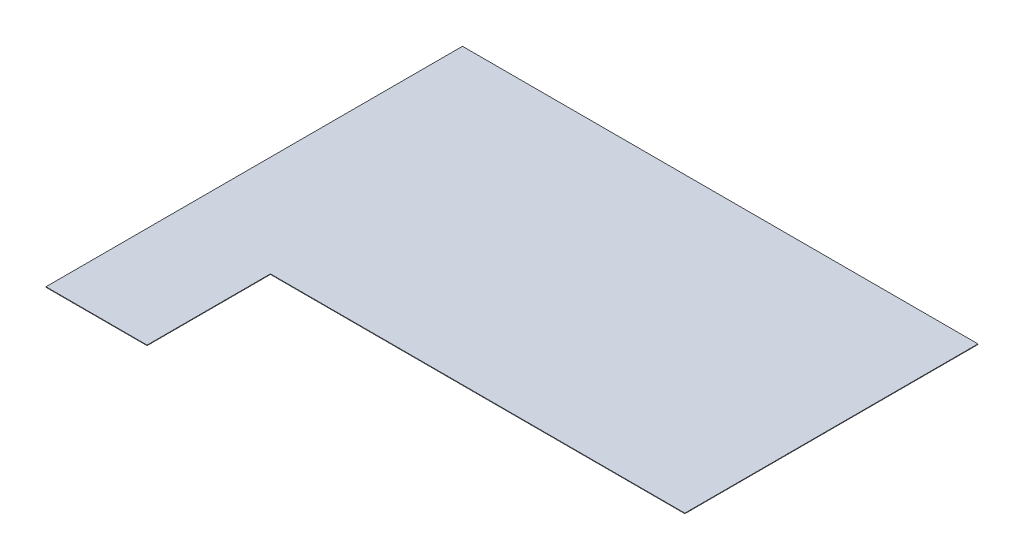
ISO-10303-21;
HEADER;
FILE_DESCRIPTION(('STEP AP214'),'2;1');
FILE_NAME('part.step','',(''),(''),'','','');
FILE_SCHEMA(('AUTOMOTIVE_DESIGN { 1 0 10303 214 1 1 1 1 }'));
ENDSEC;
DATA;
#1=APPLICATION_CONTEXT('core data for automotive mechanical design processes');
#2=APPLICATION_PROTOCOL_DEFINITION('international standard','automotive_design',2000,#1);
#3=PRODUCT_CONTEXT('',#1,'mechanical');
#4=PRODUCT('Part','Part','',(#3));
#5=PRODUCT_RELATED_PRODUCT_CATEGORY('part','',(#4));
#6=PRODUCT_DEFINITION_FORMATION('','',#4);
#7=PRODUCT_DEFINITION_CONTEXT('part definition',#1,'design');
#8=PRODUCT_DEFINITION('design','',#6,#7);
#9=PRODUCT_DEFINITION_SHAPE('','',#8);
#10=(LENGTH_UNIT() NAMED_UNIT(*) SI_UNIT(.MILLI.,.METRE.));
#11=(NAMED_UNIT(*) PLANE_ANGLE_UNIT() SI_UNIT($,.RADIAN.));
#12=(NAMED_UNIT(*) SI_UNIT($,.STERADIAN.) SOLID_ANGLE_UNIT());
#13=UNCERTAINTY_MEASURE_WITH_UNIT(LENGTH_MEASURE(1.E-05),#10,'distance_accuracy_value','');
#14=(GEOMETRIC_REPRESENTATION_CONTEXT(3) GLOBAL_UNCERTAINTY_ASSIGNED_CONTEXT((#13)) GLOBAL_UNIT_ASSIGNED_CONTEXT((#10,
#11,#12)) REPRESENTATION_CONTEXT('',''));
#15=CARTESIAN_POINT('',(0.,0.,0.));
#16=DIRECTION('',(0.,0.,1.));
#17=DIRECTION('',(1.,0.,0.));
#18=AXIS2_PLACEMENT_3D('',#15,#16,#17);
#19=CARTESIAN_POINT('',(-5100.,5.,4120.28297252394));
#20=DIRECTION('',(0.,0.,-1.));
#21=DIRECTION('',(-1.,0.,0.));
#22=AXIS2_PLACEMENT_3D('',#19,#20,#21);
#23=PLANE('',#22);
#24=DIRECTION('',(1.,0.,0.));
#25=VECTOR('',#24,1.);
#26=CARTESIAN_POINT('',(-5100.,0.,4120.28297252394));
#27=LINE('',#26,#25);
#28=CARTESIAN_POINT('',(-5100.,0.,4120.28297252394));
#29=VERTEX_POINT('',#28);
#30=CARTESIAN_POINT('',(-4100.,0.,4120.28297252394));
#31=VERTEX_POINT('',#30);
#32=EDGE_CURVE('E123',#29,#31,#27,.T.);
#33=ORIENTED_EDGE('',*,*,#32,.T.);
#34=DIRECTION('',(0.,-1.,0.));
#35=VECTOR('',#34,1.);
#36=CARTESIAN_POINT('',(-4100.,5.,4120.28297252394));
#37=LINE('',#36,#35);
#38=CARTESIAN_POINT('',(-4100.,5.,4120.28297252394));
#39=VERTEX_POINT('',#38);
#40=EDGE_CURVE('E11',#39,#31,#37,.T.);
#41=ORIENTED_EDGE('',*,*,#40,.F.);
#42=DIRECTION('',(1.,0.,0.));
#43=VECTOR('',#42,1.);
#44=CARTESIAN_POINT('',(-5100.,5.,4120.28297252394));
#45=LINE('',#44,#43);
#46=CARTESIAN_POINT('',(-5100.,5.,4120.28297252394));
#47=VERTEX_POINT('',#46);
#48=EDGE_CURVE('E133',#47,#39,#45,.T.);
#49=ORIENTED_EDGE('',*,*,#48,.F.);
#50=DIRECTION('',(0.,-1.,0.));
#51=VECTOR('',#50,1.);
#52=CARTESIAN_POINT('',(-5100.,5.,4120.28297252394));
#53=LINE('',#52,#51);
#54=EDGE_CURVE('E119',#47,#29,#53,.T.);
#55=ORIENTED_EDGE('',*,*,#54,.T.);
#56=EDGE_LOOP('',(#33,#41,#49,#55));
#57=FACE_BOUND('',#56,.T.);
#58=ADVANCED_FACE('F39',(#57),#23,.F.);
#59=CARTESIAN_POINT('',(-4100.,5.,4120.28297252394));
#60=DIRECTION('',(-1.,0.,0.));
#61=DIRECTION('',(0.,0.,1.));
#62=AXIS2_PLACEMENT_3D('',#59,#60,#61);
#63=PLANE('',#62);
#64=DIRECTION('',(0.,0.,-1.));
#65=VECTOR('',#64,1.);
#66=CARTESIAN_POINT('',(-4100.,0.,4120.28297252394));
#67=LINE('',#66,#65);
#68=CARTESIAN_POINT('',(-4100.,0.,2900.));
#69=VERTEX_POINT('',#68);
#70=EDGE_CURVE('E126',#31,#69,#67,.T.);
#71=ORIENTED_EDGE('',*,*,#70,.T.);
#72=DIRECTION('',(0.,-1.,0.));
#73=VECTOR('',#72,1.);
#74=CARTESIAN_POINT('',(-4100.,5.,2900.));
#75=LINE('',#74,#73);
#76=CARTESIAN_POINT('',(-4100.,5.,2900.));
#77=VERTEX_POINT('',#76);
#78=EDGE_CURVE('E47',#77,#69,#75,.T.);
#79=ORIENTED_EDGE('',*,*,#78,.F.);
#80=DIRECTION('',(0.,0.,-1.));
#81=VECTOR('',#80,1.);
#82=CARTESIAN_POINT('',(-4100.,5.,4120.28297252394));
#83=LINE('',#82,#81);
#84=EDGE_CURVE('E92',#39,#77,#83,.T.);
#85=ORIENTED_EDGE('',*,*,#84,.F.);
#86=ORIENTED_EDGE('',*,*,#40,.T.);
#87=EDGE_LOOP('',(#71,#79,#85,#86));
#88=FACE_BOUND('',#87,.T.);
#89=ADVANCED_FACE('F157',(#88),#63,.F.);
#90=CARTESIAN_POINT('',(-4100.,5.,2900.));
#91=DIRECTION('',(0.,0.,-1.));
#92=DIRECTION('',(-1.,0.,0.));
#93=AXIS2_PLACEMENT_3D('',#90,#91,#92);
#94=PLANE('',#93);
#95=DIRECTION('',(1.,0.,0.));
#96=VECTOR('',#95,1.);
#97=CARTESIAN_POINT('',(-4100.,0.,2900.));
#98=LINE('',#97,#96);
#99=CARTESIAN_POINT('',(-8.88178419700125E-13,0.,2900.));
#100=VERTEX_POINT('',#99);
#101=EDGE_CURVE('E128',#69,#100,#98,.T.);
#102=ORIENTED_EDGE('',*,*,#101,.T.);
#103=DIRECTION('',(0.,-1.,0.));
#104=VECTOR('',#103,1.);
#105=CARTESIAN_POINT('',(-8.88178419700125E-13,5.,2900.));
#106=LINE('',#105,#104);
#107=CARTESIAN_POINT('',(-8.88178419700125E-13,5.,2900.));
#108=VERTEX_POINT('',#107);
#109=EDGE_CURVE('E114',#108,#100,#106,.T.);
#110=ORIENTED_EDGE('',*,*,#109,.F.);
#111=DIRECTION('',(1.,0.,0.));
#112=VECTOR('',#111,1.);
#113=CARTESIAN_POINT('',(-4100.,5.,2900.));
#114=LINE('',#113,#112);
#115=EDGE_CURVE('E105',#77,#108,#114,.T.);
#116=ORIENTED_EDGE('',*,*,#115,.F.);
#117=ORIENTED_EDGE('',*,*,#78,.T.);
#118=EDGE_LOOP('',(#102,#110,#116,#117));
#119=FACE_BOUND('',#118,.T.);
#120=ADVANCED_FACE('F139',(#119),#94,.F.);
#121=CARTESIAN_POINT('',(-8.88178419700125E-13,5.,2900.));
#122=DIRECTION('',(-1.,0.,0.));
#123=DIRECTION('',(0.,0.,1.));
#124=AXIS2_PLACEMENT_3D('',#121,#122,#123);
#125=PLANE('',#124);
#126=DIRECTION('',(0.,0.,-1.));
#127=VECTOR('',#126,1.);
#128=CARTESIAN_POINT('',(-8.88178419700125E-13,0.,2900.));
#129=LINE('',#128,#127);
#130=CARTESIAN_POINT('',(-1.23836331271339E-12,0.,0.));
#131=VERTEX_POINT('',#130);
#132=EDGE_CURVE('E113',#100,#131,#129,.T.);
#133=ORIENTED_EDGE('',*,*,#132,.T.);
#134=DIRECTION('',(0.,-1.,0.));
#135=VECTOR('',#134,1.);
#136=CARTESIAN_POINT('',(-1.23836331271339E-12,5.,0.));
#137=LINE('',#136,#135);
#138=CARTESIAN_POINT('',(-1.23836331271339E-12,5.,0.));
#139=VERTEX_POINT('',#138);
#140=EDGE_CURVE('E110',#139,#131,#137,.T.);
#141=ORIENTED_EDGE('',*,*,#140,.F.);
#142=DIRECTION('',(0.,0.,-1.));
#143=VECTOR('',#142,1.);
#144=CARTESIAN_POINT('',(-8.88178419700125E-13,5.,2900.));
#145=LINE('',#144,#143);
#146=EDGE_CURVE('E99',#108,#139,#145,.T.);
#147=ORIENTED_EDGE('',*,*,#146,.F.);
#148=ORIENTED_EDGE('',*,*,#109,.T.);
#149=EDGE_LOOP('',(#133,#141,#147,#148));
#150=FACE_BOUND('',#149,.T.);
#151=ADVANCED_FACE('F111',(#150),#125,.F.);
#152=CARTESIAN_POINT('',(-1.23836331271339E-12,5.,0.));
#153=DIRECTION('',(0.,0.,1.));
#154=DIRECTION('',(1.,0.,0.));
#155=AXIS2_PLACEMENT_3D('',#152,#153,#154);
#156=PLANE('',#155);
#157=DIRECTION('',(-1.,0.,0.));
#158=VECTOR('',#157,1.);
#159=CARTESIAN_POINT('',(-1.23836331271339E-12,0.,0.));
#160=LINE('',#159,#158);
#161=CARTESIAN_POINT('',(-5100.,0.,0.));
#162=VERTEX_POINT('',#161);
#163=EDGE_CURVE('E78',#131,#162,#160,.T.);
#164=ORIENTED_EDGE('',*,*,#163,.T.);
#165=DIRECTION('',(0.,-1.,0.));
#166=VECTOR('',#165,1.);
#167=CARTESIAN_POINT('',(-5100.,5.,0.));
#168=LINE('',#167,#166);
#169=CARTESIAN_POINT('',(-5100.,5.,0.));
#170=VERTEX_POINT('',#169);
#171=EDGE_CURVE('E115',#170,#162,#168,.T.);
#172=ORIENTED_EDGE('',*,*,#171,.F.);
#173=DIRECTION('',(-1.,0.,0.));
#174=VECTOR('',#173,1.);
#175=CARTESIAN_POINT('',(-1.23836331271339E-12,5.,0.));
#176=LINE('',#175,#174);
#177=EDGE_CURVE('E103',#139,#170,#176,.T.);
#178=ORIENTED_EDGE('',*,*,#177,.F.);
#179=ORIENTED_EDGE('',*,*,#140,.T.);
#180=EDGE_LOOP('',(#164,#172,#178,#179));
#181=FACE_BOUND('',#180,.T.);
#182=ADVANCED_FACE('F117',(#181),#156,.F.);
#183=CARTESIAN_POINT('',(-5100.,5.,0.));
#184=DIRECTION('',(1.,0.,0.));
#185=DIRECTION('',(0.,0.,-1.));
#186=AXIS2_PLACEMENT_3D('',#183,#184,#185);
#187=PLANE('',#186);
#188=DIRECTION('',(0.,0.,1.));
#189=VECTOR('',#188,1.);
#190=CARTESIAN_POINT('',(-5100.,0.,0.));
#191=LINE('',#190,#189);
#192=EDGE_CURVE('E84',#162,#29,#191,.T.);
#193=ORIENTED_EDGE('',*,*,#192,.T.);
#194=ORIENTED_EDGE('',*,*,#54,.F.);
#195=DIRECTION('',(0.,0.,1.));
#196=VECTOR('',#195,1.);
#197=CARTESIAN_POINT('',(-5100.,5.,0.));
#198=LINE('',#197,#196);
#199=EDGE_CURVE('E55',#170,#47,#198,.T.);
#200=ORIENTED_EDGE('',*,*,#199,.F.);
#201=ORIENTED_EDGE('',*,*,#171,.T.);
#202=EDGE_LOOP('',(#193,#194,#200,#201));
#203=FACE_BOUND('',#202,.T.);
#204=ADVANCED_FACE('F146',(#203),#187,.F.);
#205=CARTESIAN_POINT('',(0.,5.,0.));
#206=DIRECTION('',(0.,1.,0.));
#207=DIRECTION('',(0.,0.,1.));
#208=AXIS2_PLACEMENT_3D('',#205,#206,#207);
#209=PLANE('',#208);
#210=ORIENTED_EDGE('',*,*,#48,.T.);
#211=ORIENTED_EDGE('',*,*,#84,.T.);
#212=ORIENTED_EDGE('',*,*,#115,.T.);
#213=ORIENTED_EDGE('',*,*,#146,.T.);
#214=ORIENTED_EDGE('',*,*,#177,.T.);
#215=ORIENTED_EDGE('',*,*,#199,.T.);
#216=EDGE_LOOP('',(#210,#211,#212,#213,#214,#215));
#217=FACE_BOUND('',#216,.T.);
#218=ADVANCED_FACE('F101',(#217),#209,.T.);
#219=CARTESIAN_POINT('',(0.,0.,0.));
#220=DIRECTION('',(0.,1.,0.));
#221=DIRECTION('',(0.,0.,1.));
#222=AXIS2_PLACEMENT_3D('',#219,#220,#221);
#223=PLANE('',#222);
#224=ORIENTED_EDGE('',*,*,#32,.F.);
#225=ORIENTED_EDGE('',*,*,#192,.F.);
#226=ORIENTED_EDGE('',*,*,#163,.F.);
#227=ORIENTED_EDGE('',*,*,#132,.F.);
#228=ORIENTED_EDGE('',*,*,#101,.F.);
#229=ORIENTED_EDGE('',*,*,#70,.F.);
#230=EDGE_LOOP('',(#224,#225,#226,#227,#228,#229));
#231=FACE_BOUND('',#230,.T.);
#232=ADVANCED_FACE('F142',(#231),#223,.F.);
#233=CLOSED_SHELL('',(#58,#89,#120,#151,#182,#204,#218,#232));
#234=MANIFOLD_SOLID_BREP('B2',#233);
#235=ADVANCED_BREP_SHAPE_REPRESENTATION('',(#18,#234),#14);
#236=SHAPE_DEFINITION_REPRESENTATION(#9,#235);
ENDSEC;
END-ISO-10303-21;
